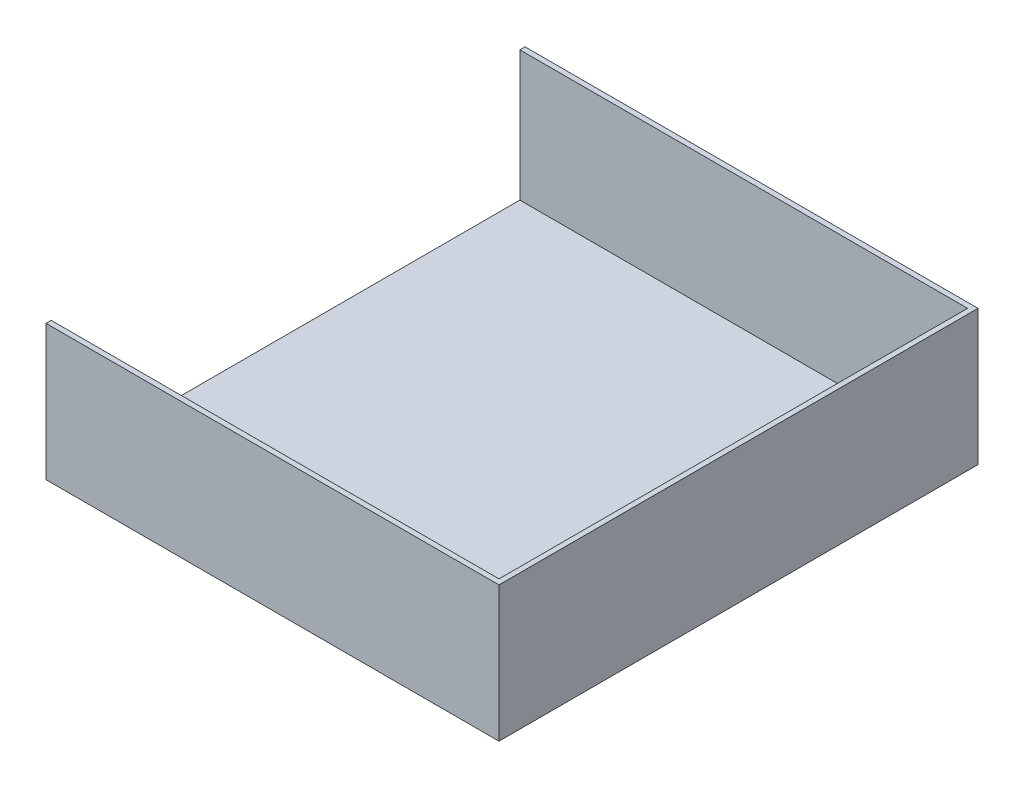
ISO-10303-21;
HEADER;
FILE_DESCRIPTION(('STEP AP214'),'2;1');
FILE_NAME('part.step','',(''),(''),'','','');
FILE_SCHEMA(('AUTOMOTIVE_DESIGN { 1 0 10303 214 1 1 1 1 }'));
ENDSEC;
DATA;
#1=APPLICATION_CONTEXT('core data for automotive mechanical design processes');
#2=APPLICATION_PROTOCOL_DEFINITION('international standard','automotive_design',2000,#1);
#3=PRODUCT_CONTEXT('',#1,'mechanical');
#4=PRODUCT('Part','Part','',(#3));
#5=PRODUCT_RELATED_PRODUCT_CATEGORY('part','',(#4));
#6=PRODUCT_DEFINITION_FORMATION('','',#4);
#7=PRODUCT_DEFINITION_CONTEXT('part definition',#1,'design');
#8=PRODUCT_DEFINITION('design','',#6,#7);
#9=PRODUCT_DEFINITION_SHAPE('','',#8);
#10=(LENGTH_UNIT() NAMED_UNIT(*) SI_UNIT(.MILLI.,.METRE.));
#11=(NAMED_UNIT(*) PLANE_ANGLE_UNIT() SI_UNIT($,.RADIAN.));
#12=(NAMED_UNIT(*) SI_UNIT($,.STERADIAN.) SOLID_ANGLE_UNIT());
#13=UNCERTAINTY_MEASURE_WITH_UNIT(LENGTH_MEASURE(1.E-05),#10,'distance_accuracy_value','');
#14=(GEOMETRIC_REPRESENTATION_CONTEXT(3) GLOBAL_UNCERTAINTY_ASSIGNED_CONTEXT((#13)) GLOBAL_UNIT_ASSIGNED_CONTEXT((#10,
#11,#12)) REPRESENTATION_CONTEXT('',''));
#15=CARTESIAN_POINT('',(0.,0.,0.));
#16=DIRECTION('',(0.,0.,1.));
#17=DIRECTION('',(1.,0.,0.));
#18=AXIS2_PLACEMENT_3D('',#15,#16,#17);
#19=CARTESIAN_POINT('',(0.,82.55,0.));
#20=DIRECTION('',(0.,0.,-1.));
#21=DIRECTION('',(-1.,0.,0.));
#22=AXIS2_PLACEMENT_3D('',#19,#20,#21);
#23=PLANE('',#22);
#24=DIRECTION('',(1.,0.,0.));
#25=VECTOR('',#24,1.);
#26=CARTESIAN_POINT('',(0.,82.55,0.));
#27=LINE('',#26,#25);
#28=CARTESIAN_POINT('',(3.17499999999995,82.55,0.));
#29=VERTEX_POINT('',#28);
#30=CARTESIAN_POINT('',(279.4,82.55,0.));
#31=VERTEX_POINT('',#30);
#32=EDGE_CURVE('E131',#29,#31,#27,.T.);
#33=ORIENTED_EDGE('',*,*,#32,.F.);
#34=DIRECTION('',(0.,1.,0.));
#35=VECTOR('',#34,1.);
#36=CARTESIAN_POINT('',(3.17499999999995,-0.001000000000001,0.));
#37=LINE('',#36,#35);
#38=CARTESIAN_POINT('',(3.17499999999995,0.,0.));
#39=VERTEX_POINT('',#38);
#40=EDGE_CURVE('E121',#39,#29,#37,.T.);
#41=ORIENTED_EDGE('',*,*,#40,.F.);
#42=DIRECTION('',(1.,0.,0.));
#43=VECTOR('',#42,1.);
#44=CARTESIAN_POINT('',(0.,0.,0.));
#45=LINE('',#44,#43);
#46=CARTESIAN_POINT('',(279.4,0.,0.));
#47=VERTEX_POINT('',#46);
#48=EDGE_CURVE('E62',#39,#47,#45,.T.);
#49=ORIENTED_EDGE('',*,*,#48,.T.);
#50=DIRECTION('',(0.,-1.,0.));
#51=VECTOR('',#50,1.);
#52=CARTESIAN_POINT('',(279.4,82.55,0.));
#53=LINE('',#52,#51);
#54=EDGE_CURVE('E11',#31,#47,#53,.T.);
#55=ORIENTED_EDGE('',*,*,#54,.F.);
#56=EDGE_LOOP('',(#33,#41,#49,#55));
#57=FACE_BOUND('',#56,.T.);
#58=ADVANCED_FACE('F35',(#57),#23,.F.);
#59=CARTESIAN_POINT('',(279.4,82.55,0.));
#60=DIRECTION('',(-1.,0.,0.));
#61=DIRECTION('',(0.,0.,1.));
#62=AXIS2_PLACEMENT_3D('',#59,#60,#61);
#63=PLANE('',#62);
#64=DIRECTION('',(0.,0.,-1.));
#65=VECTOR('',#64,1.);
#66=CARTESIAN_POINT('',(279.4,0.,0.));
#67=LINE('',#66,#65);
#68=CARTESIAN_POINT('',(279.4,0.,-292.1));
#69=VERTEX_POINT('',#68);
#70=EDGE_CURVE('E132',#47,#69,#67,.T.);
#71=ORIENTED_EDGE('',*,*,#70,.T.);
#72=DIRECTION('',(0.,-1.,0.));
#73=VECTOR('',#72,1.);
#74=CARTESIAN_POINT('',(279.4,82.55,-292.1));
#75=LINE('',#74,#73);
#76=CARTESIAN_POINT('',(279.4,82.55,-292.1));
#77=VERTEX_POINT('',#76);
#78=EDGE_CURVE('E43',#77,#69,#75,.T.);
#79=ORIENTED_EDGE('',*,*,#78,.F.);
#80=DIRECTION('',(0.,0.,-1.));
#81=VECTOR('',#80,1.);
#82=CARTESIAN_POINT('',(279.4,82.55,0.));
#83=LINE('',#82,#81);
#84=EDGE_CURVE('E51',#31,#77,#83,.T.);
#85=ORIENTED_EDGE('',*,*,#84,.F.);
#86=ORIENTED_EDGE('',*,*,#54,.T.);
#87=EDGE_LOOP('',(#71,#79,#85,#86));
#88=FACE_BOUND('',#87,.T.);
#89=ADVANCED_FACE('F176',(#88),#63,.F.);
#90=CARTESIAN_POINT('',(0.,82.55,-292.1));
#91=DIRECTION('',(0.,0.,1.));
#92=DIRECTION('',(1.,0.,0.));
#93=AXIS2_PLACEMENT_3D('',#90,#91,#92);
#94=PLANE('',#93);
#95=DIRECTION('',(-1.,0.,0.));
#96=VECTOR('',#95,1.);
#97=CARTESIAN_POINT('',(0.,0.,-292.1));
#98=LINE('',#97,#96);
#99=CARTESIAN_POINT('',(3.17499999999994,0.,-292.1));
#100=VERTEX_POINT('',#99);
#101=EDGE_CURVE('E127',#69,#100,#98,.T.);
#102=ORIENTED_EDGE('',*,*,#101,.T.);
#103=DIRECTION('',(0.,1.,0.));
#104=VECTOR('',#103,1.);
#105=CARTESIAN_POINT('',(3.17499999999993,-0.001000000000001,-292.1));
#106=LINE('',#105,#104);
#107=CARTESIAN_POINT('',(3.17499999999993,82.55,-292.1));
#108=VERTEX_POINT('',#107);
#109=EDGE_CURVE('E111',#100,#108,#106,.T.);
#110=ORIENTED_EDGE('',*,*,#109,.T.);
#111=DIRECTION('',(-1.,0.,0.));
#112=VECTOR('',#111,1.);
#113=CARTESIAN_POINT('',(0.,82.55,-292.1));
#114=LINE('',#113,#112);
#115=EDGE_CURVE('E137',#77,#108,#114,.T.);
#116=ORIENTED_EDGE('',*,*,#115,.F.);
#117=ORIENTED_EDGE('',*,*,#78,.T.);
#118=EDGE_LOOP('',(#102,#110,#116,#117));
#119=FACE_BOUND('',#118,.T.);
#120=ADVANCED_FACE('F130',(#119),#94,.F.);
#121=CARTESIAN_POINT('',(0.,82.55,0.));
#122=DIRECTION('',(0.,-1.,0.));
#123=DIRECTION('',(0.,0.,-1.));
#124=AXIS2_PLACEMENT_3D('',#121,#122,#123);
#125=PLANE('',#124);
#126=ORIENTED_EDGE('',*,*,#115,.T.);
#127=DIRECTION('',(0.,0.,-1.));
#128=VECTOR('',#127,1.);
#129=CARTESIAN_POINT('',(3.17499999999995,82.55,0.));
#130=LINE('',#129,#128);
#131=CARTESIAN_POINT('',(3.17499999999993,82.55,-288.925));
#132=VERTEX_POINT('',#131);
#133=EDGE_CURVE('E116',#132,#108,#130,.T.);
#134=ORIENTED_EDGE('',*,*,#133,.F.);
#135=DIRECTION('',(-1.,0.,0.));
#136=VECTOR('',#135,1.);
#137=CARTESIAN_POINT('',(276.225,82.55,-288.925));
#138=LINE('',#137,#136);
#139=CARTESIAN_POINT('',(276.225,82.55,-288.925));
#140=VERTEX_POINT('',#139);
#141=EDGE_CURVE('E146',#140,#132,#138,.T.);
#142=ORIENTED_EDGE('',*,*,#141,.F.);
#143=DIRECTION('',(0.,0.,-1.));
#144=VECTOR('',#143,1.);
#145=CARTESIAN_POINT('',(276.225,82.55,-3.175));
#146=LINE('',#145,#144);
#147=CARTESIAN_POINT('',(276.225,82.55,-3.175));
#148=VERTEX_POINT('',#147);
#149=EDGE_CURVE('E163',#148,#140,#146,.T.);
#150=ORIENTED_EDGE('',*,*,#149,.F.);
#151=DIRECTION('',(1.,0.,0.));
#152=VECTOR('',#151,1.);
#153=CARTESIAN_POINT('',(3.175,82.55,-3.175));
#154=LINE('',#153,#152);
#155=CARTESIAN_POINT('',(3.17499999999995,82.55,-3.175));
#156=VERTEX_POINT('',#155);
#157=EDGE_CURVE('E120',#156,#148,#154,.T.);
#158=ORIENTED_EDGE('',*,*,#157,.F.);
#159=EDGE_CURVE('E170',#29,#156,#130,.T.);
#160=ORIENTED_EDGE('',*,*,#159,.F.);
#161=ORIENTED_EDGE('',*,*,#32,.T.);
#162=ORIENTED_EDGE('',*,*,#84,.T.);
#163=EDGE_LOOP('',(#126,#134,#142,#150,#158,#160,#161,#162));
#164=FACE_BOUND('',#163,.T.);
#165=ADVANCED_FACE('F174',(#164),#125,.F.);
#166=CARTESIAN_POINT('',(0.,0.,0.));
#167=DIRECTION('',(0.,-1.,0.));
#168=DIRECTION('',(0.,0.,-1.));
#169=AXIS2_PLACEMENT_3D('',#166,#167,#168);
#170=PLANE('',#169);
#171=DIRECTION('',(0.,0.,-1.));
#172=VECTOR('',#171,1.);
#173=CARTESIAN_POINT('',(3.17499999999995,0.,0.));
#174=LINE('',#173,#172);
#175=EDGE_CURVE('E114',#39,#100,#174,.T.);
#176=ORIENTED_EDGE('',*,*,#175,.T.);
#177=ORIENTED_EDGE('',*,*,#101,.F.);
#178=ORIENTED_EDGE('',*,*,#70,.F.);
#179=ORIENTED_EDGE('',*,*,#48,.F.);
#180=EDGE_LOOP('',(#176,#177,#178,#179));
#181=FACE_BOUND('',#180,.T.);
#182=ADVANCED_FACE('F125',(#181),#170,.T.);
#183=CARTESIAN_POINT('',(276.225,3.175,-288.925));
#184=DIRECTION('',(0.,0.,-1.));
#185=DIRECTION('',(-1.,0.,0.));
#186=AXIS2_PLACEMENT_3D('',#183,#184,#185);
#187=PLANE('',#186);
#188=ORIENTED_EDGE('',*,*,#141,.T.);
#189=DIRECTION('',(0.,1.,0.));
#190=VECTOR('',#189,1.);
#191=CARTESIAN_POINT('',(3.17499999999994,3.175,-288.925));
#192=LINE('',#191,#190);
#193=CARTESIAN_POINT('',(3.17499999999993,3.175,-288.925));
#194=VERTEX_POINT('',#193);
#195=EDGE_CURVE('E140',#194,#132,#192,.T.);
#196=ORIENTED_EDGE('',*,*,#195,.F.);
#197=DIRECTION('',(-1.,0.,0.));
#198=VECTOR('',#197,1.);
#199=CARTESIAN_POINT('',(276.225,3.175,-288.925));
#200=LINE('',#199,#198);
#201=CARTESIAN_POINT('',(276.225,3.175,-288.925));
#202=VERTEX_POINT('',#201);
#203=EDGE_CURVE('E150',#202,#194,#200,.T.);
#204=ORIENTED_EDGE('',*,*,#203,.F.);
#205=DIRECTION('',(0.,1.,0.));
#206=VECTOR('',#205,1.);
#207=CARTESIAN_POINT('',(276.225,3.175,-288.925));
#208=LINE('',#207,#206);
#209=EDGE_CURVE('E71',#202,#140,#208,.T.);
#210=ORIENTED_EDGE('',*,*,#209,.T.);
#211=EDGE_LOOP('',(#188,#196,#204,#210));
#212=FACE_BOUND('',#211,.T.);
#213=ADVANCED_FACE('F188',(#212),#187,.F.);
#214=CARTESIAN_POINT('',(276.225,3.175,-3.175));
#215=DIRECTION('',(1.,0.,0.));
#216=DIRECTION('',(0.,0.,-1.));
#217=AXIS2_PLACEMENT_3D('',#214,#215,#216);
#218=PLANE('',#217);
#219=ORIENTED_EDGE('',*,*,#149,.T.);
#220=ORIENTED_EDGE('',*,*,#209,.F.);
#221=DIRECTION('',(0.,0.,-1.));
#222=VECTOR('',#221,1.);
#223=CARTESIAN_POINT('',(276.225,3.175,-3.175));
#224=LINE('',#223,#222);
#225=CARTESIAN_POINT('',(276.225,3.175,-3.175));
#226=VERTEX_POINT('',#225);
#227=EDGE_CURVE('E155',#226,#202,#224,.T.);
#228=ORIENTED_EDGE('',*,*,#227,.F.);
#229=DIRECTION('',(0.,1.,0.));
#230=VECTOR('',#229,1.);
#231=CARTESIAN_POINT('',(276.225,3.175,-3.175));
#232=LINE('',#231,#230);
#233=EDGE_CURVE('E143',#226,#148,#232,.T.);
#234=ORIENTED_EDGE('',*,*,#233,.T.);
#235=EDGE_LOOP('',(#219,#220,#228,#234));
#236=FACE_BOUND('',#235,.T.);
#237=ADVANCED_FACE('F195',(#236),#218,.F.);
#238=CARTESIAN_POINT('',(3.175,3.175,-3.175));
#239=DIRECTION('',(0.,0.,1.));
#240=DIRECTION('',(1.,0.,0.));
#241=AXIS2_PLACEMENT_3D('',#238,#239,#240);
#242=PLANE('',#241);
#243=ORIENTED_EDGE('',*,*,#157,.T.);
#244=ORIENTED_EDGE('',*,*,#233,.F.);
#245=DIRECTION('',(1.,0.,0.));
#246=VECTOR('',#245,1.);
#247=CARTESIAN_POINT('',(3.175,3.175,-3.175));
#248=LINE('',#247,#246);
#249=CARTESIAN_POINT('',(3.175,3.175,-3.175));
#250=VERTEX_POINT('',#249);
#251=EDGE_CURVE('E159',#250,#226,#248,.T.);
#252=ORIENTED_EDGE('',*,*,#251,.F.);
#253=DIRECTION('',(0.,1.,0.));
#254=VECTOR('',#253,1.);
#255=CARTESIAN_POINT('',(3.175,3.175,-3.175));
#256=LINE('',#255,#254);
#257=EDGE_CURVE('E90',#250,#156,#256,.T.);
#258=ORIENTED_EDGE('',*,*,#257,.T.);
#259=EDGE_LOOP('',(#243,#244,#252,#258));
#260=FACE_BOUND('',#259,.T.);
#261=ADVANCED_FACE('F191',(#260),#242,.F.);
#262=CARTESIAN_POINT('',(0.,3.175,0.));
#263=DIRECTION('',(0.,1.,0.));
#264=DIRECTION('',(0.,0.,1.));
#265=AXIS2_PLACEMENT_3D('',#262,#263,#264);
#266=PLANE('',#265);
#267=DIRECTION('',(0.,0.,1.));
#268=VECTOR('',#267,1.);
#269=CARTESIAN_POINT('',(3.17499999999994,3.175,-288.925));
#270=LINE('',#269,#268);
#271=EDGE_CURVE('E166',#194,#250,#270,.T.);
#272=ORIENTED_EDGE('',*,*,#271,.T.);
#273=ORIENTED_EDGE('',*,*,#251,.T.);
#274=ORIENTED_EDGE('',*,*,#227,.T.);
#275=ORIENTED_EDGE('',*,*,#203,.T.);
#276=EDGE_LOOP('',(#272,#273,#274,#275));
#277=FACE_BOUND('',#276,.T.);
#278=ADVANCED_FACE('F194',(#277),#266,.T.);
#279=CARTESIAN_POINT('',(3.17499999999995,-0.001000000000001,0.));
#280=DIRECTION('',(1.,0.,0.));
#281=DIRECTION('',(0.,0.,-1.));
#282=AXIS2_PLACEMENT_3D('',#279,#280,#281);
#283=PLANE('',#282);
#284=ORIENTED_EDGE('',*,*,#133,.T.);
#285=ORIENTED_EDGE('',*,*,#109,.F.);
#286=ORIENTED_EDGE('',*,*,#175,.F.);
#287=ORIENTED_EDGE('',*,*,#40,.T.);
#288=ORIENTED_EDGE('',*,*,#159,.T.);
#289=ORIENTED_EDGE('',*,*,#257,.F.);
#290=ORIENTED_EDGE('',*,*,#271,.F.);
#291=ORIENTED_EDGE('',*,*,#195,.T.);
#292=EDGE_LOOP('',(#284,#285,#286,#287,#288,#289,#290,#291));
#293=FACE_BOUND('',#292,.T.);
#294=ADVANCED_FACE('F113',(#293),#283,.F.);
#295=CLOSED_SHELL('',(#58,#89,#120,#165,#182,#213,#237,#261,#278,#294));
#296=MANIFOLD_SOLID_BREP('B2',#295);
#297=ADVANCED_BREP_SHAPE_REPRESENTATION('',(#18,#296),#14);
#298=SHAPE_DEFINITION_REPRESENTATION(#9,#297);
ENDSEC;
END-ISO-10303-21;
